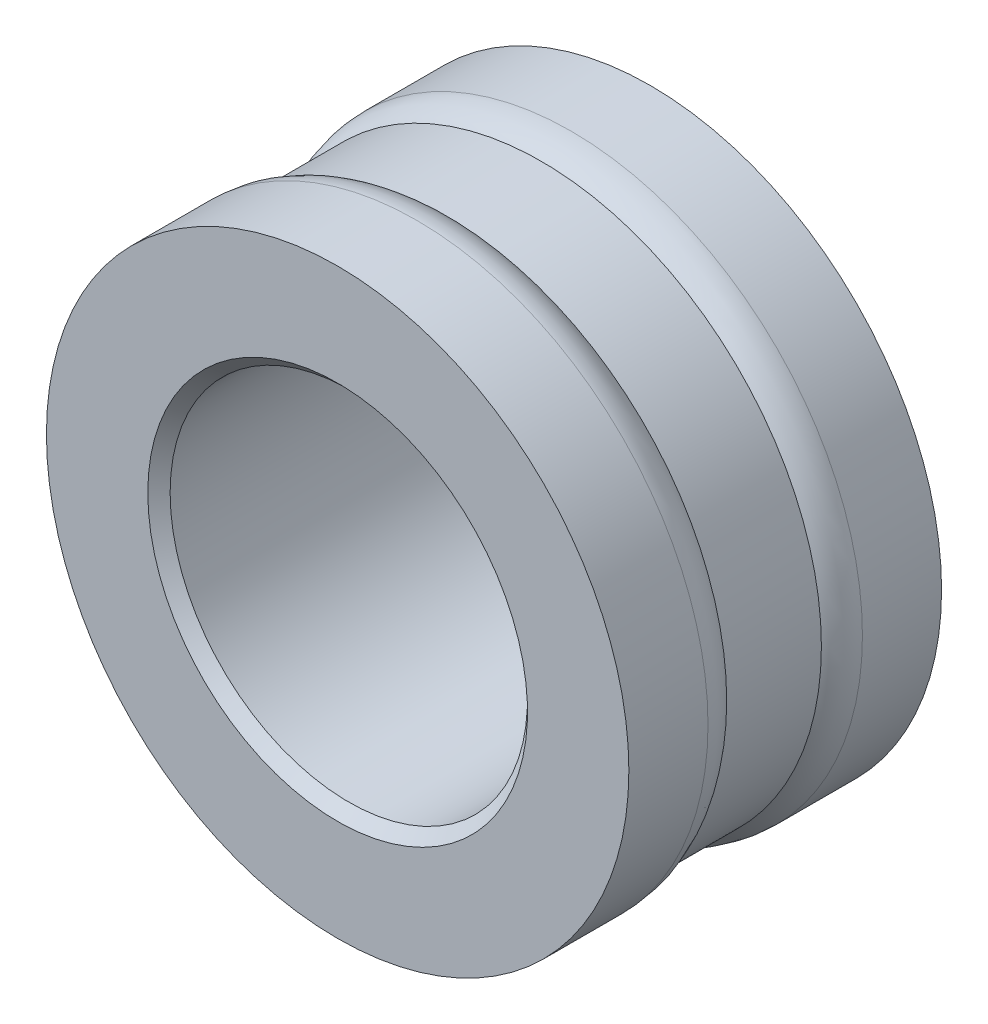
ISO-10303-21;
HEADER;
FILE_DESCRIPTION(('STEP AP214'),'2;1');
FILE_NAME('part.step','',(''),(''),'','','');
FILE_SCHEMA(('AUTOMOTIVE_DESIGN { 1 0 10303 214 1 1 1 1 }'));
ENDSEC;
DATA;
#1=APPLICATION_CONTEXT('core data for automotive mechanical design processes');
#2=APPLICATION_PROTOCOL_DEFINITION('international standard','automotive_design',2000,#1);
#3=PRODUCT_CONTEXT('',#1,'mechanical');
#4=PRODUCT('Part','Part','',(#3));
#5=PRODUCT_RELATED_PRODUCT_CATEGORY('part','',(#4));
#6=PRODUCT_DEFINITION_FORMATION('','',#4);
#7=PRODUCT_DEFINITION_CONTEXT('part definition',#1,'design');
#8=PRODUCT_DEFINITION('design','',#6,#7);
#9=PRODUCT_DEFINITION_SHAPE('','',#8);
#10=(LENGTH_UNIT() NAMED_UNIT(*) SI_UNIT(.MILLI.,.METRE.));
#11=(NAMED_UNIT(*) PLANE_ANGLE_UNIT() SI_UNIT($,.RADIAN.));
#12=(NAMED_UNIT(*) SI_UNIT($,.STERADIAN.) SOLID_ANGLE_UNIT());
#13=UNCERTAINTY_MEASURE_WITH_UNIT(LENGTH_MEASURE(1.E-05),#10,'distance_accuracy_value','');
#14=(GEOMETRIC_REPRESENTATION_CONTEXT(3) GLOBAL_UNCERTAINTY_ASSIGNED_CONTEXT((#13)) GLOBAL_UNIT_ASSIGNED_CONTEXT((#10,
#11,#12)) REPRESENTATION_CONTEXT('',''));
#15=CARTESIAN_POINT('',(0.,0.,0.));
#16=DIRECTION('',(0.,0.,1.));
#17=DIRECTION('',(1.,0.,0.));
#18=AXIS2_PLACEMENT_3D('',#15,#16,#17);
#19=CARTESIAN_POINT('',(0.,0.,0.));
#20=DIRECTION('',(0.,0.,-1.));
#21=DIRECTION('',(1.,0.,0.));
#22=AXIS2_PLACEMENT_3D('',#19,#20,#21);
#23=CYLINDRICAL_SURFACE('',#22,6.519);
#24=CARTESIAN_POINT('',(0.,0.,-7.));
#25=DIRECTION('',(0.,0.,1.));
#26=DIRECTION('',(1.,0.,0.));
#27=AXIS2_PLACEMENT_3D('',#24,#25,#26);
#28=CIRCLE('',#27,6.519);
#29=CARTESIAN_POINT('',(-6.519,0.,-7.));
#30=VERTEX_POINT('',#29);
#31=EDGE_CURVE('E164',#30,#30,#28,.T.);
#32=ORIENTED_EDGE('',*,*,#31,.T.);
#33=DIRECTION('',(0.,0.,1.));
#34=VECTOR('',#33,1.);
#35=CARTESIAN_POINT('',(-6.519,0.,0.));
#36=LINE('',#35,#34);
#37=CARTESIAN_POINT('',(-6.519,0.,-5.22842512587393));
#38=VERTEX_POINT('',#37);
#39=EDGE_CURVE('E11',#30,#38,#36,.T.);
#40=ORIENTED_EDGE('',*,*,#39,.T.);
#41=CARTESIAN_POINT('',(0.,0.,-5.22842512587393));
#42=DIRECTION('',(0.,0.,-1.));
#43=DIRECTION('',(1.,0.,0.));
#44=AXIS2_PLACEMENT_3D('',#41,#42,#43);
#45=CIRCLE('',#44,6.519);
#46=EDGE_CURVE('E147',#38,#38,#45,.T.);
#47=ORIENTED_EDGE('',*,*,#46,.T.);
#48=ORIENTED_EDGE('',*,*,#39,.F.);
#49=EDGE_LOOP('',(#32,#40,#47,#48));
#50=FACE_BOUND('',#49,.T.);
#51=ADVANCED_FACE('F47',(#50),#23,.T.);
#52=CARTESIAN_POINT('',(0.,0.,-5.22842512587393));
#53=DIRECTION('',(0.,0.,-1.));
#54=DIRECTION('',(1.,0.,0.));
#55=AXIS2_PLACEMENT_3D('',#52,#53,#54);
#56=TOROIDAL_SURFACE('',#55,5.5,1.019);
#57=ORIENTED_EDGE('',*,*,#46,.F.);
#58=CARTESIAN_POINT('',(-5.5,0.,-5.22842512587393));
#59=DIRECTION('',(0.,1.,0.));
#60=DIRECTION('',(-1.,0.,0.));
#61=AXIS2_PLACEMENT_3D('',#58,#59,#60);
#62=CIRCLE('',#61,1.019);
#63=CARTESIAN_POINT('',(-6.269,0.,-4.55984453985606));
#64=VERTEX_POINT('',#63);
#65=EDGE_CURVE('E59',#38,#64,#62,.T.);
#66=ORIENTED_EDGE('',*,*,#65,.T.);
#67=CARTESIAN_POINT('',(0.,0.,-4.55984453985606));
#68=DIRECTION('',(0.,0.,-1.));
#69=DIRECTION('',(1.,0.,0.));
#70=AXIS2_PLACEMENT_3D('',#67,#68,#69);
#71=CIRCLE('',#70,6.269);
#72=EDGE_CURVE('E142',#64,#64,#71,.T.);
#73=ORIENTED_EDGE('',*,*,#72,.T.);
#74=ORIENTED_EDGE('',*,*,#65,.F.);
#75=EDGE_LOOP('',(#57,#66,#73,#74));
#76=FACE_BOUND('',#75,.T.);
#77=ADVANCED_FACE('F183',(#76),#56,.T.);
#78=CARTESIAN_POINT('',(0.,0.,-3.5));
#79=DIRECTION('',(0.,0.,-1.));
#80=DIRECTION('',(1.,0.,0.));
#81=AXIS2_PLACEMENT_3D('',#78,#79,#80);
#82=CYLINDRICAL_SURFACE('',#81,6.269);
#83=CARTESIAN_POINT('',(0.,0.,-2.44015546014394));
#84=DIRECTION('',(0.,0.,1.));
#85=DIRECTION('',(1.,0.,0.));
#86=AXIS2_PLACEMENT_3D('',#83,#84,#85);
#87=CIRCLE('',#86,6.269);
#88=CARTESIAN_POINT('',(-6.269,0.,-2.44015546014394));
#89=VERTEX_POINT('',#88);
#90=CARTESIAN_POINT('',(6.269,0.,-2.44015546014394));
#91=VERTEX_POINT('',#90);
#92=EDGE_CURVE('E140',#89,#91,#87,.T.);
#93=ORIENTED_EDGE('',*,*,#92,.F.);
#94=DIRECTION('',(0.,0.,-1.));
#95=VECTOR('',#94,1.);
#96=CARTESIAN_POINT('',(-6.269,0.,-3.5));
#97=LINE('',#96,#95);
#98=EDGE_CURVE('E118',#89,#64,#97,.T.);
#99=ORIENTED_EDGE('',*,*,#98,.T.);
#100=ORIENTED_EDGE('',*,*,#72,.F.);
#101=ORIENTED_EDGE('',*,*,#98,.F.);
#102=CARTESIAN_POINT('',(0.,0.,-2.44015546014394));
#103=DIRECTION('',(0.,0.,1.));
#104=DIRECTION('',(1.,0.,0.));
#105=AXIS2_PLACEMENT_3D('',#102,#103,#104);
#106=CIRCLE('',#105,6.269);
#107=EDGE_CURVE('E128',#91,#89,#106,.T.);
#108=ORIENTED_EDGE('',*,*,#107,.F.);
#109=EDGE_LOOP('',(#93,#99,#100,#101,#108));
#110=FACE_BOUND('',#109,.T.);
#111=ADVANCED_FACE('F181',(#110),#82,.T.);
#112=CARTESIAN_POINT('',(0.,0.,0.));
#113=DIRECTION('',(0.,0.,-1.));
#114=DIRECTION('',(1.,0.,0.));
#115=AXIS2_PLACEMENT_3D('',#112,#113,#114);
#116=CYLINDRICAL_SURFACE('',#115,6.519);
#117=CARTESIAN_POINT('',(0.,0.,-1.77157487412607));
#118=DIRECTION('',(0.,0.,1.));
#119=DIRECTION('',(1.,0.,0.));
#120=AXIS2_PLACEMENT_3D('',#117,#118,#119);
#121=CIRCLE('',#120,6.519);
#122=CARTESIAN_POINT('',(-6.519,0.,-1.77157487412607));
#123=VERTEX_POINT('',#122);
#124=CARTESIAN_POINT('',(6.519,0.,-1.77157487412607));
#125=VERTEX_POINT('',#124);
#126=EDGE_CURVE('E116',#123,#125,#121,.T.);
#127=ORIENTED_EDGE('',*,*,#126,.T.);
#128=CARTESIAN_POINT('',(0.,0.,-1.77157487412607));
#129=DIRECTION('',(0.,0.,1.));
#130=DIRECTION('',(1.,0.,0.));
#131=AXIS2_PLACEMENT_3D('',#128,#129,#130);
#132=CIRCLE('',#131,6.519);
#133=EDGE_CURVE('E120',#125,#123,#132,.T.);
#134=ORIENTED_EDGE('',*,*,#133,.T.);
#135=DIRECTION('',(0.,0.,1.));
#136=VECTOR('',#135,1.);
#137=CARTESIAN_POINT('',(-6.519,0.,0.));
#138=LINE('',#137,#136);
#139=CARTESIAN_POINT('',(-6.519,0.,0.));
#140=VERTEX_POINT('',#139);
#141=EDGE_CURVE('E115',#123,#140,#138,.T.);
#142=ORIENTED_EDGE('',*,*,#141,.T.);
#143=CARTESIAN_POINT('',(0.,0.,0.));
#144=DIRECTION('',(0.,0.,1.));
#145=DIRECTION('',(1.,0.,0.));
#146=AXIS2_PLACEMENT_3D('',#143,#144,#145);
#147=CIRCLE('',#146,6.519);
#148=EDGE_CURVE('E117',#140,#140,#147,.T.);
#149=ORIENTED_EDGE('',*,*,#148,.F.);
#150=ORIENTED_EDGE('',*,*,#141,.F.);
#151=EDGE_LOOP('',(#127,#134,#142,#149,#150));
#152=FACE_BOUND('',#151,.T.);
#153=ADVANCED_FACE('F114',(#152),#116,.T.);
#154=CARTESIAN_POINT('',(0.,0.,-1.77157487412607));
#155=DIRECTION('',(0.,0.,1.));
#156=DIRECTION('',(-1.,0.,0.));
#157=AXIS2_PLACEMENT_3D('',#154,#155,#156);
#158=TOROIDAL_SURFACE('',#157,5.5,1.019);
#159=ORIENTED_EDGE('',*,*,#126,.F.);
#160=ORIENTED_EDGE('',*,*,#133,.F.);
#161=CARTESIAN_POINT('',(5.5,0.,-1.77157487412607));
#162=DIRECTION('',(0.,1.,0.));
#163=DIRECTION('',(1.,0.,0.));
#164=AXIS2_PLACEMENT_3D('',#161,#162,#163);
#165=CIRCLE('',#164,1.019);
#166=EDGE_CURVE('E127',#125,#91,#165,.T.);
#167=ORIENTED_EDGE('',*,*,#166,.T.);
#168=ORIENTED_EDGE('',*,*,#107,.T.);
#169=ORIENTED_EDGE('',*,*,#92,.T.);
#170=ORIENTED_EDGE('',*,*,#166,.F.);
#171=EDGE_LOOP('',(#159,#160,#167,#168,#169,#170));
#172=FACE_BOUND('',#171,.T.);
#173=ADVANCED_FACE('F126',(#172),#158,.T.);
#174=CARTESIAN_POINT('',(0.,0.,0.));
#175=DIRECTION('',(0.,0.,-1.));
#176=DIRECTION('',(1.,0.,0.));
#177=AXIS2_PLACEMENT_3D('',#174,#175,#176);
#178=PLANE('',#177);
#179=CARTESIAN_POINT('',(0.,0.,0.));
#180=DIRECTION('',(0.,0.,-1.));
#181=DIRECTION('',(1.,0.,0.));
#182=AXIS2_PLACEMENT_3D('',#179,#180,#181);
#183=CIRCLE('',#182,4.25);
#184=CARTESIAN_POINT('',(-4.25,0.,0.));
#185=VERTEX_POINT('',#184);
#186=EDGE_CURVE('E137',#185,#185,#183,.T.);
#187=ORIENTED_EDGE('',*,*,#186,.T.);
#188=EDGE_LOOP('',(#187));
#189=FACE_BOUND('',#188,.T.);
#190=ORIENTED_EDGE('',*,*,#148,.T.);
#191=EDGE_LOOP('',(#190));
#192=FACE_BOUND('',#191,.T.);
#193=ADVANCED_FACE('F191',(#189,#192),#178,.F.);
#194=CARTESIAN_POINT('',(0.,0.,-0.125));
#195=DIRECTION('',(0.,0.,1.));
#196=DIRECTION('',(1.,0.,0.));
#197=AXIS2_PLACEMENT_3D('',#194,#195,#196);
#198=CONICAL_SURFACE('',#197,4.125,0.785398163397449);
#199=CARTESIAN_POINT('',(0.,0.,-0.25));
#200=DIRECTION('',(0.,0.,1.));
#201=DIRECTION('',(1.,0.,0.));
#202=AXIS2_PLACEMENT_3D('',#199,#200,#201);
#203=CIRCLE('',#202,4.);
#204=CARTESIAN_POINT('',(-4.,0.,-0.25));
#205=VERTEX_POINT('',#204);
#206=EDGE_CURVE('E161',#205,#205,#203,.T.);
#207=ORIENTED_EDGE('',*,*,#206,.F.);
#208=DIRECTION('',(-0.707106781186548,0.,0.707106781186547));
#209=VECTOR('',#208,1.);
#210=CARTESIAN_POINT('',(-4.125,0.,-0.125));
#211=LINE('',#210,#209);
#212=EDGE_CURVE('E167',#205,#185,#211,.T.);
#213=ORIENTED_EDGE('',*,*,#212,.T.);
#214=ORIENTED_EDGE('',*,*,#186,.F.);
#215=ORIENTED_EDGE('',*,*,#212,.F.);
#216=EDGE_LOOP('',(#207,#213,#214,#215));
#217=FACE_BOUND('',#216,.T.);
#218=ADVANCED_FACE('F199',(#217),#198,.F.);
#219=CARTESIAN_POINT('',(0.,0.,-7.));
#220=DIRECTION('',(0.,0.,-1.));
#221=DIRECTION('',(1.,0.,0.));
#222=AXIS2_PLACEMENT_3D('',#219,#220,#221);
#223=PLANE('',#222);
#224=CARTESIAN_POINT('',(0.,0.,-7.));
#225=DIRECTION('',(0.,0.,1.));
#226=DIRECTION('',(1.,0.,0.));
#227=AXIS2_PLACEMENT_3D('',#224,#225,#226);
#228=CIRCLE('',#227,4.25);
#229=CARTESIAN_POINT('',(-4.25,0.,-7.));
#230=VERTEX_POINT('',#229);
#231=EDGE_CURVE('E219',#230,#230,#228,.T.);
#232=ORIENTED_EDGE('',*,*,#231,.T.);
#233=EDGE_LOOP('',(#232));
#234=FACE_BOUND('',#233,.T.);
#235=ORIENTED_EDGE('',*,*,#31,.F.);
#236=EDGE_LOOP('',(#235));
#237=FACE_BOUND('',#236,.T.);
#238=ADVANCED_FACE('F205',(#234,#237),#223,.T.);
#239=CARTESIAN_POINT('',(0.,0.,0.));
#240=DIRECTION('',(0.,0.,-1.));
#241=DIRECTION('',(1.,0.,0.));
#242=AXIS2_PLACEMENT_3D('',#239,#240,#241);
#243=CYLINDRICAL_SURFACE('',#242,4.);
#244=CARTESIAN_POINT('',(0.,0.,-6.75));
#245=DIRECTION('',(0.,0.,-1.));
#246=DIRECTION('',(1.,0.,0.));
#247=AXIS2_PLACEMENT_3D('',#244,#245,#246);
#248=CIRCLE('',#247,4.);
#249=CARTESIAN_POINT('',(-4.,0.,-6.75));
#250=VERTEX_POINT('',#249);
#251=EDGE_CURVE('E162',#250,#250,#248,.T.);
#252=ORIENTED_EDGE('',*,*,#251,.T.);
#253=DIRECTION('',(0.,0.,1.));
#254=VECTOR('',#253,1.);
#255=CARTESIAN_POINT('',(-4.,0.,0.));
#256=LINE('',#255,#254);
#257=EDGE_CURVE('E159',#250,#205,#256,.T.);
#258=ORIENTED_EDGE('',*,*,#257,.T.);
#259=ORIENTED_EDGE('',*,*,#206,.T.);
#260=ORIENTED_EDGE('',*,*,#257,.F.);
#261=EDGE_LOOP('',(#252,#258,#259,#260));
#262=FACE_BOUND('',#261,.T.);
#263=ADVANCED_FACE('F206',(#262),#243,.F.);
#264=CARTESIAN_POINT('',(0.,0.,-6.875));
#265=DIRECTION('',(0.,0.,-1.));
#266=DIRECTION('',(1.,0.,0.));
#267=AXIS2_PLACEMENT_3D('',#264,#265,#266);
#268=CONICAL_SURFACE('',#267,4.125,0.785398163397448);
#269=ORIENTED_EDGE('',*,*,#231,.F.);
#270=DIRECTION('',(0.707106781186548,0.,0.707106781186548));
#271=VECTOR('',#270,1.);
#272=CARTESIAN_POINT('',(-4.125,0.,-6.875));
#273=LINE('',#272,#271);
#274=EDGE_CURVE('E160',#230,#250,#273,.T.);
#275=ORIENTED_EDGE('',*,*,#274,.T.);
#276=ORIENTED_EDGE('',*,*,#251,.F.);
#277=ORIENTED_EDGE('',*,*,#274,.F.);
#278=EDGE_LOOP('',(#269,#275,#276,#277));
#279=FACE_BOUND('',#278,.T.);
#280=ADVANCED_FACE('F210',(#279),#268,.F.);
#281=CLOSED_SHELL('',(#51,#77,#111,#153,#173,#193,#218,#238,#263,#280));
#282=MANIFOLD_SOLID_BREP('B2',#281);
#283=ADVANCED_BREP_SHAPE_REPRESENTATION('',(#18,#282),#14);
#284=SHAPE_DEFINITION_REPRESENTATION(#9,#283);
ENDSEC;
END-ISO-10303-21;
